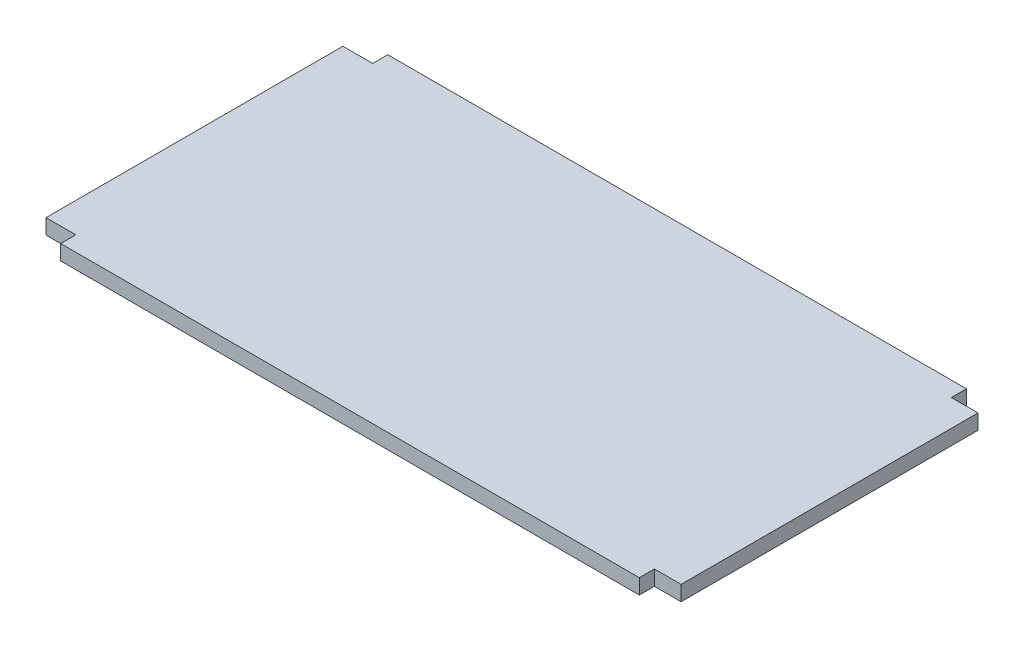
ISO-10303-21;
HEADER;
FILE_DESCRIPTION(('STEP AP214'),'2;1');
FILE_NAME('part.step','',(''),(''),'','','');
FILE_SCHEMA(('AUTOMOTIVE_DESIGN { 1 0 10303 214 1 1 1 1 }'));
ENDSEC;
DATA;
#1=APPLICATION_CONTEXT('core data for automotive mechanical design processes');
#2=APPLICATION_PROTOCOL_DEFINITION('international standard','automotive_design',2000,#1);
#3=PRODUCT_CONTEXT('',#1,'mechanical');
#4=PRODUCT('Part','Part','',(#3));
#5=PRODUCT_RELATED_PRODUCT_CATEGORY('part','',(#4));
#6=PRODUCT_DEFINITION_FORMATION('','',#4);
#7=PRODUCT_DEFINITION_CONTEXT('part definition',#1,'design');
#8=PRODUCT_DEFINITION('design','',#6,#7);
#9=PRODUCT_DEFINITION_SHAPE('','',#8);
#10=(LENGTH_UNIT() NAMED_UNIT(*) SI_UNIT(.MILLI.,.METRE.));
#11=(NAMED_UNIT(*) PLANE_ANGLE_UNIT() SI_UNIT($,.RADIAN.));
#12=(NAMED_UNIT(*) SI_UNIT($,.STERADIAN.) SOLID_ANGLE_UNIT());
#13=UNCERTAINTY_MEASURE_WITH_UNIT(LENGTH_MEASURE(1.E-05),#10,'distance_accuracy_value','');
#14=(GEOMETRIC_REPRESENTATION_CONTEXT(3) GLOBAL_UNCERTAINTY_ASSIGNED_CONTEXT((#13)) GLOBAL_UNIT_ASSIGNED_CONTEXT((#10,
#11,#12)) REPRESENTATION_CONTEXT('',''));
#15=CARTESIAN_POINT('',(0.,0.,0.));
#16=DIRECTION('',(0.,0.,1.));
#17=DIRECTION('',(1.,0.,0.));
#18=AXIS2_PLACEMENT_3D('',#15,#16,#17);
#19=CARTESIAN_POINT('',(57.5,-3.,29.5));
#20=DIRECTION('',(1.,0.,0.));
#21=DIRECTION('',(0.,0.,-1.));
#22=AXIS2_PLACEMENT_3D('',#19,#20,#21);
#23=PLANE('',#22);
#24=DIRECTION('',(0.,0.,-1.));
#25=VECTOR('',#24,1.);
#26=CARTESIAN_POINT('',(57.5,0.,29.5));
#27=LINE('',#26,#25);
#28=CARTESIAN_POINT('',(57.5,0.,32.5));
#29=VERTEX_POINT('',#28);
#30=CARTESIAN_POINT('',(57.5,0.,29.5));
#31=VERTEX_POINT('',#30);
#32=EDGE_CURVE('E154',#29,#31,#27,.T.);
#33=ORIENTED_EDGE('',*,*,#32,.F.);
#34=DIRECTION('',(0.,1.,0.));
#35=VECTOR('',#34,1.);
#36=CARTESIAN_POINT('',(57.5,-3.,32.5));
#37=LINE('',#36,#35);
#38=CARTESIAN_POINT('',(57.5,-3.,32.5));
#39=VERTEX_POINT('',#38);
#40=EDGE_CURVE('E11',#39,#29,#37,.T.);
#41=ORIENTED_EDGE('',*,*,#40,.F.);
#42=DIRECTION('',(0.,0.,-1.));
#43=VECTOR('',#42,1.);
#44=CARTESIAN_POINT('',(57.5,-3.,29.5));
#45=LINE('',#44,#43);
#46=CARTESIAN_POINT('',(57.5,-3.,29.5));
#47=VERTEX_POINT('',#46);
#48=EDGE_CURVE('E186',#39,#47,#45,.T.);
#49=ORIENTED_EDGE('',*,*,#48,.T.);
#50=DIRECTION('',(0.,1.,0.));
#51=VECTOR('',#50,1.);
#52=CARTESIAN_POINT('',(57.5,-3.,29.5));
#53=LINE('',#52,#51);
#54=EDGE_CURVE('E36',#47,#31,#53,.T.);
#55=ORIENTED_EDGE('',*,*,#54,.T.);
#56=EDGE_LOOP('',(#33,#41,#49,#55));
#57=FACE_BOUND('',#56,.T.);
#58=ADVANCED_FACE('F33',(#57),#23,.T.);
#59=CARTESIAN_POINT('',(-57.5,-3.,32.5));
#60=DIRECTION('',(0.,0.,1.));
#61=DIRECTION('',(1.,0.,0.));
#62=AXIS2_PLACEMENT_3D('',#59,#60,#61);
#63=PLANE('',#62);
#64=DIRECTION('',(1.,0.,0.));
#65=VECTOR('',#64,1.);
#66=CARTESIAN_POINT('',(-57.5,0.,32.5));
#67=LINE('',#66,#65);
#68=CARTESIAN_POINT('',(-57.5,0.,32.5));
#69=VERTEX_POINT('',#68);
#70=EDGE_CURVE('E184',#69,#29,#67,.T.);
#71=ORIENTED_EDGE('',*,*,#70,.F.);
#72=DIRECTION('',(0.,1.,0.));
#73=VECTOR('',#72,1.);
#74=CARTESIAN_POINT('',(-57.5,-3.,32.5));
#75=LINE('',#74,#73);
#76=CARTESIAN_POINT('',(-57.5,-3.,32.5));
#77=VERTEX_POINT('',#76);
#78=EDGE_CURVE('E42',#77,#69,#75,.T.);
#79=ORIENTED_EDGE('',*,*,#78,.F.);
#80=DIRECTION('',(1.,0.,0.));
#81=VECTOR('',#80,1.);
#82=CARTESIAN_POINT('',(-57.5,-3.,32.5));
#83=LINE('',#82,#81);
#84=EDGE_CURVE('E144',#77,#39,#83,.T.);
#85=ORIENTED_EDGE('',*,*,#84,.T.);
#86=ORIENTED_EDGE('',*,*,#40,.T.);
#87=EDGE_LOOP('',(#71,#79,#85,#86));
#88=FACE_BOUND('',#87,.T.);
#89=ADVANCED_FACE('F206',(#88),#63,.T.);
#90=CARTESIAN_POINT('',(-57.5,-3.,29.5));
#91=DIRECTION('',(-1.,0.,0.));
#92=DIRECTION('',(0.,0.,1.));
#93=AXIS2_PLACEMENT_3D('',#90,#91,#92);
#94=PLANE('',#93);
#95=DIRECTION('',(0.,0.,1.));
#96=VECTOR('',#95,1.);
#97=CARTESIAN_POINT('',(-57.5,0.,29.5));
#98=LINE('',#97,#96);
#99=CARTESIAN_POINT('',(-57.5,0.,29.5));
#100=VERTEX_POINT('',#99);
#101=EDGE_CURVE('E131',#100,#69,#98,.T.);
#102=ORIENTED_EDGE('',*,*,#101,.F.);
#103=DIRECTION('',(0.,1.,0.));
#104=VECTOR('',#103,1.);
#105=CARTESIAN_POINT('',(-57.5,-3.,29.5));
#106=LINE('',#105,#104);
#107=CARTESIAN_POINT('',(-57.5,-3.,29.5));
#108=VERTEX_POINT('',#107);
#109=EDGE_CURVE('E126',#108,#100,#106,.T.);
#110=ORIENTED_EDGE('',*,*,#109,.F.);
#111=DIRECTION('',(0.,0.,1.));
#112=VECTOR('',#111,1.);
#113=CARTESIAN_POINT('',(-57.5,-3.,29.5));
#114=LINE('',#113,#112);
#115=EDGE_CURVE('E129',#108,#77,#114,.T.);
#116=ORIENTED_EDGE('',*,*,#115,.T.);
#117=ORIENTED_EDGE('',*,*,#78,.T.);
#118=EDGE_LOOP('',(#102,#110,#116,#117));
#119=FACE_BOUND('',#118,.T.);
#120=ADVANCED_FACE('F128',(#119),#94,.T.);
#121=CARTESIAN_POINT('',(-63.418,-3.,29.5));
#122=DIRECTION('',(0.,0.,1.));
#123=DIRECTION('',(1.,0.,0.));
#124=AXIS2_PLACEMENT_3D('',#121,#122,#123);
#125=PLANE('',#124);
#126=DIRECTION('',(1.,0.,0.));
#127=VECTOR('',#126,1.);
#128=CARTESIAN_POINT('',(-63.418,0.,29.5));
#129=LINE('',#128,#127);
#130=CARTESIAN_POINT('',(-63.418,0.,29.5));
#131=VERTEX_POINT('',#130);
#132=EDGE_CURVE('E181',#131,#100,#129,.T.);
#133=ORIENTED_EDGE('',*,*,#132,.F.);
#134=DIRECTION('',(0.,1.,0.));
#135=VECTOR('',#134,1.);
#136=CARTESIAN_POINT('',(-63.418,-3.,29.5));
#137=LINE('',#136,#135);
#138=CARTESIAN_POINT('',(-63.418,-3.,29.5));
#139=VERTEX_POINT('',#138);
#140=EDGE_CURVE('E136',#139,#131,#137,.T.);
#141=ORIENTED_EDGE('',*,*,#140,.F.);
#142=DIRECTION('',(1.,0.,0.));
#143=VECTOR('',#142,1.);
#144=CARTESIAN_POINT('',(-63.418,-3.,29.5));
#145=LINE('',#144,#143);
#146=EDGE_CURVE('E142',#139,#108,#145,.T.);
#147=ORIENTED_EDGE('',*,*,#146,.T.);
#148=ORIENTED_EDGE('',*,*,#109,.T.);
#149=EDGE_LOOP('',(#133,#141,#147,#148));
#150=FACE_BOUND('',#149,.T.);
#151=ADVANCED_FACE('F146',(#150),#125,.T.);
#152=CARTESIAN_POINT('',(-63.418,-3.,-29.5));
#153=DIRECTION('',(-1.,0.,0.));
#154=DIRECTION('',(0.,0.,1.));
#155=AXIS2_PLACEMENT_3D('',#152,#153,#154);
#156=PLANE('',#155);
#157=DIRECTION('',(0.,0.,1.));
#158=VECTOR('',#157,1.);
#159=CARTESIAN_POINT('',(-63.418,0.,-29.5));
#160=LINE('',#159,#158);
#161=CARTESIAN_POINT('',(-63.418,0.,-29.5));
#162=VERTEX_POINT('',#161);
#163=EDGE_CURVE('E178',#162,#131,#160,.T.);
#164=ORIENTED_EDGE('',*,*,#163,.F.);
#165=DIRECTION('',(0.,1.,0.));
#166=VECTOR('',#165,1.);
#167=CARTESIAN_POINT('',(-63.418,-3.,-29.5));
#168=LINE('',#167,#166);
#169=CARTESIAN_POINT('',(-63.418,-3.,-29.5));
#170=VERTEX_POINT('',#169);
#171=EDGE_CURVE('E190',#170,#162,#168,.T.);
#172=ORIENTED_EDGE('',*,*,#171,.F.);
#173=DIRECTION('',(0.,0.,1.));
#174=VECTOR('',#173,1.);
#175=CARTESIAN_POINT('',(-63.418,-3.,-29.5));
#176=LINE('',#175,#174);
#177=EDGE_CURVE('E147',#170,#139,#176,.T.);
#178=ORIENTED_EDGE('',*,*,#177,.T.);
#179=ORIENTED_EDGE('',*,*,#140,.T.);
#180=EDGE_LOOP('',(#164,#172,#178,#179));
#181=FACE_BOUND('',#180,.T.);
#182=ADVANCED_FACE('F219',(#181),#156,.T.);
#183=CARTESIAN_POINT('',(-57.5,-3.,-29.5));
#184=DIRECTION('',(0.,0.,-1.));
#185=DIRECTION('',(-1.,0.,0.));
#186=AXIS2_PLACEMENT_3D('',#183,#184,#185);
#187=PLANE('',#186);
#188=DIRECTION('',(-1.,0.,0.));
#189=VECTOR('',#188,1.);
#190=CARTESIAN_POINT('',(-57.5,0.,-29.5));
#191=LINE('',#190,#189);
#192=CARTESIAN_POINT('',(-57.5,0.,-29.5));
#193=VERTEX_POINT('',#192);
#194=EDGE_CURVE('E175',#193,#162,#191,.T.);
#195=ORIENTED_EDGE('',*,*,#194,.F.);
#196=DIRECTION('',(0.,1.,0.));
#197=VECTOR('',#196,1.);
#198=CARTESIAN_POINT('',(-57.5,-3.,-29.5));
#199=LINE('',#198,#197);
#200=CARTESIAN_POINT('',(-57.5,-3.,-29.5));
#201=VERTEX_POINT('',#200);
#202=EDGE_CURVE('E192',#201,#193,#199,.T.);
#203=ORIENTED_EDGE('',*,*,#202,.F.);
#204=DIRECTION('',(-1.,0.,0.));
#205=VECTOR('',#204,1.);
#206=CARTESIAN_POINT('',(-57.5,-3.,-29.5));
#207=LINE('',#206,#205);
#208=EDGE_CURVE('E149',#201,#170,#207,.T.);
#209=ORIENTED_EDGE('',*,*,#208,.T.);
#210=ORIENTED_EDGE('',*,*,#171,.T.);
#211=EDGE_LOOP('',(#195,#203,#209,#210));
#212=FACE_BOUND('',#211,.T.);
#213=ADVANCED_FACE('F222',(#212),#187,.T.);
#214=CARTESIAN_POINT('',(-57.5,-3.,-32.5));
#215=DIRECTION('',(-1.,0.,0.));
#216=DIRECTION('',(0.,0.,1.));
#217=AXIS2_PLACEMENT_3D('',#214,#215,#216);
#218=PLANE('',#217);
#219=DIRECTION('',(0.,0.,1.));
#220=VECTOR('',#219,1.);
#221=CARTESIAN_POINT('',(-57.5,0.,-32.5));
#222=LINE('',#221,#220);
#223=CARTESIAN_POINT('',(-57.5,0.,-32.5));
#224=VERTEX_POINT('',#223);
#225=EDGE_CURVE('E172',#224,#193,#222,.T.);
#226=ORIENTED_EDGE('',*,*,#225,.F.);
#227=DIRECTION('',(0.,1.,0.));
#228=VECTOR('',#227,1.);
#229=CARTESIAN_POINT('',(-57.5,-3.,-32.5));
#230=LINE('',#229,#228);
#231=CARTESIAN_POINT('',(-57.5,-3.,-32.5));
#232=VERTEX_POINT('',#231);
#233=EDGE_CURVE('E194',#232,#224,#230,.T.);
#234=ORIENTED_EDGE('',*,*,#233,.F.);
#235=DIRECTION('',(0.,0.,1.));
#236=VECTOR('',#235,1.);
#237=CARTESIAN_POINT('',(-57.5,-3.,-32.5));
#238=LINE('',#237,#236);
#239=EDGE_CURVE('E348',#232,#201,#238,.T.);
#240=ORIENTED_EDGE('',*,*,#239,.T.);
#241=ORIENTED_EDGE('',*,*,#202,.T.);
#242=EDGE_LOOP('',(#226,#234,#240,#241));
#243=FACE_BOUND('',#242,.T.);
#244=ADVANCED_FACE('F226',(#243),#218,.T.);
#245=CARTESIAN_POINT('',(-57.5,-3.,-32.5));
#246=DIRECTION('',(0.,0.,-1.));
#247=DIRECTION('',(-1.,0.,0.));
#248=AXIS2_PLACEMENT_3D('',#245,#246,#247);
#249=PLANE('',#248);
#250=DIRECTION('',(-1.,0.,0.));
#251=VECTOR('',#250,1.);
#252=CARTESIAN_POINT('',(-57.5,0.,-32.5));
#253=LINE('',#252,#251);
#254=CARTESIAN_POINT('',(57.5,0.,-32.5));
#255=VERTEX_POINT('',#254);
#256=EDGE_CURVE('E169',#255,#224,#253,.T.);
#257=ORIENTED_EDGE('',*,*,#256,.F.);
#258=DIRECTION('',(0.,1.,0.));
#259=VECTOR('',#258,1.);
#260=CARTESIAN_POINT('',(57.5,-3.,-32.5));
#261=LINE('',#260,#259);
#262=CARTESIAN_POINT('',(57.5,-3.,-32.5));
#263=VERTEX_POINT('',#262);
#264=EDGE_CURVE('E196',#263,#255,#261,.T.);
#265=ORIENTED_EDGE('',*,*,#264,.F.);
#266=DIRECTION('',(-1.,0.,0.));
#267=VECTOR('',#266,1.);
#268=CARTESIAN_POINT('',(-57.5,-3.,-32.5));
#269=LINE('',#268,#267);
#270=EDGE_CURVE('E352',#263,#232,#269,.T.);
#271=ORIENTED_EDGE('',*,*,#270,.T.);
#272=ORIENTED_EDGE('',*,*,#233,.T.);
#273=EDGE_LOOP('',(#257,#265,#271,#272));
#274=FACE_BOUND('',#273,.T.);
#275=ADVANCED_FACE('F230',(#274),#249,.T.);
#276=CARTESIAN_POINT('',(57.5,-3.,-32.5));
#277=DIRECTION('',(1.,0.,0.));
#278=DIRECTION('',(0.,0.,-1.));
#279=AXIS2_PLACEMENT_3D('',#276,#277,#278);
#280=PLANE('',#279);
#281=DIRECTION('',(0.,0.,-1.));
#282=VECTOR('',#281,1.);
#283=CARTESIAN_POINT('',(57.5,0.,-32.5));
#284=LINE('',#283,#282);
#285=CARTESIAN_POINT('',(57.5,0.,-29.5));
#286=VERTEX_POINT('',#285);
#287=EDGE_CURVE('E166',#286,#255,#284,.T.);
#288=ORIENTED_EDGE('',*,*,#287,.F.);
#289=DIRECTION('',(0.,1.,0.));
#290=VECTOR('',#289,1.);
#291=CARTESIAN_POINT('',(57.5,-3.,-29.5));
#292=LINE('',#291,#290);
#293=CARTESIAN_POINT('',(57.5,-3.,-29.5));
#294=VERTEX_POINT('',#293);
#295=EDGE_CURVE('E198',#294,#286,#292,.T.);
#296=ORIENTED_EDGE('',*,*,#295,.F.);
#297=DIRECTION('',(0.,0.,-1.));
#298=VECTOR('',#297,1.);
#299=CARTESIAN_POINT('',(57.5,-3.,-32.5));
#300=LINE('',#299,#298);
#301=EDGE_CURVE('E341',#294,#263,#300,.T.);
#302=ORIENTED_EDGE('',*,*,#301,.T.);
#303=ORIENTED_EDGE('',*,*,#264,.T.);
#304=EDGE_LOOP('',(#288,#296,#302,#303));
#305=FACE_BOUND('',#304,.T.);
#306=ADVANCED_FACE('F234',(#305),#280,.T.);
#307=CARTESIAN_POINT('',(57.5,-3.,-29.5));
#308=DIRECTION('',(0.,0.,-1.));
#309=DIRECTION('',(-1.,0.,0.));
#310=AXIS2_PLACEMENT_3D('',#307,#308,#309);
#311=PLANE('',#310);
#312=DIRECTION('',(-1.,0.,0.));
#313=VECTOR('',#312,1.);
#314=CARTESIAN_POINT('',(57.5,0.,-29.5));
#315=LINE('',#314,#313);
#316=CARTESIAN_POINT('',(62.806,0.,-29.5));
#317=VERTEX_POINT('',#316);
#318=EDGE_CURVE('E163',#317,#286,#315,.T.);
#319=ORIENTED_EDGE('',*,*,#318,.F.);
#320=DIRECTION('',(0.,1.,0.));
#321=VECTOR('',#320,1.);
#322=CARTESIAN_POINT('',(62.806,-3.,-29.5));
#323=LINE('',#322,#321);
#324=CARTESIAN_POINT('',(62.806,-3.,-29.5));
#325=VERTEX_POINT('',#324);
#326=EDGE_CURVE('E200',#325,#317,#323,.T.);
#327=ORIENTED_EDGE('',*,*,#326,.F.);
#328=DIRECTION('',(-1.,0.,0.));
#329=VECTOR('',#328,1.);
#330=CARTESIAN_POINT('',(57.5,-3.,-29.5));
#331=LINE('',#330,#329);
#332=EDGE_CURVE('E337',#325,#294,#331,.T.);
#333=ORIENTED_EDGE('',*,*,#332,.T.);
#334=ORIENTED_EDGE('',*,*,#295,.T.);
#335=EDGE_LOOP('',(#319,#327,#333,#334));
#336=FACE_BOUND('',#335,.T.);
#337=ADVANCED_FACE('F238',(#336),#311,.T.);
#338=CARTESIAN_POINT('',(62.806,-3.,-29.5));
#339=DIRECTION('',(1.,0.,0.));
#340=DIRECTION('',(0.,0.,-1.));
#341=AXIS2_PLACEMENT_3D('',#338,#339,#340);
#342=PLANE('',#341);
#343=DIRECTION('',(0.,0.,-1.));
#344=VECTOR('',#343,1.);
#345=CARTESIAN_POINT('',(62.806,0.,-29.5));
#346=LINE('',#345,#344);
#347=CARTESIAN_POINT('',(62.806,0.,29.5));
#348=VERTEX_POINT('',#347);
#349=EDGE_CURVE('E160',#348,#317,#346,.T.);
#350=ORIENTED_EDGE('',*,*,#349,.F.);
#351=DIRECTION('',(0.,1.,0.));
#352=VECTOR('',#351,1.);
#353=CARTESIAN_POINT('',(62.806,-3.,29.5));
#354=LINE('',#353,#352);
#355=CARTESIAN_POINT('',(62.806,-3.,29.5));
#356=VERTEX_POINT('',#355);
#357=EDGE_CURVE('E201',#356,#348,#354,.T.);
#358=ORIENTED_EDGE('',*,*,#357,.F.);
#359=DIRECTION('',(0.,0.,-1.));
#360=VECTOR('',#359,1.);
#361=CARTESIAN_POINT('',(62.806,-3.,-29.5));
#362=LINE('',#361,#360);
#363=EDGE_CURVE('E358',#356,#325,#362,.T.);
#364=ORIENTED_EDGE('',*,*,#363,.T.);
#365=ORIENTED_EDGE('',*,*,#326,.T.);
#366=EDGE_LOOP('',(#350,#358,#364,#365));
#367=FACE_BOUND('',#366,.T.);
#368=ADVANCED_FACE('F242',(#367),#342,.T.);
#369=CARTESIAN_POINT('',(62.806,-3.,29.5));
#370=DIRECTION('',(0.,0.,1.));
#371=DIRECTION('',(1.,0.,0.));
#372=AXIS2_PLACEMENT_3D('',#369,#370,#371);
#373=PLANE('',#372);
#374=DIRECTION('',(1.,0.,0.));
#375=VECTOR('',#374,1.);
#376=CARTESIAN_POINT('',(62.806,0.,29.5));
#377=LINE('',#376,#375);
#378=EDGE_CURVE('E157',#31,#348,#377,.T.);
#379=ORIENTED_EDGE('',*,*,#378,.F.);
#380=ORIENTED_EDGE('',*,*,#54,.F.);
#381=DIRECTION('',(1.,0.,0.));
#382=VECTOR('',#381,1.);
#383=CARTESIAN_POINT('',(62.806,-3.,29.5));
#384=LINE('',#383,#382);
#385=EDGE_CURVE('E360',#47,#356,#384,.T.);
#386=ORIENTED_EDGE('',*,*,#385,.T.);
#387=ORIENTED_EDGE('',*,*,#357,.T.);
#388=EDGE_LOOP('',(#379,#380,#386,#387));
#389=FACE_BOUND('',#388,.T.);
#390=ADVANCED_FACE('F203',(#389),#373,.T.);
#391=CARTESIAN_POINT('',(0.,-3.,0.));
#392=DIRECTION('',(0.,1.,0.));
#393=DIRECTION('',(0.,0.,1.));
#394=AXIS2_PLACEMENT_3D('',#391,#392,#393);
#395=PLANE('',#394);
#396=ORIENTED_EDGE('',*,*,#48,.F.);
#397=ORIENTED_EDGE('',*,*,#84,.F.);
#398=ORIENTED_EDGE('',*,*,#115,.F.);
#399=ORIENTED_EDGE('',*,*,#146,.F.);
#400=ORIENTED_EDGE('',*,*,#177,.F.);
#401=ORIENTED_EDGE('',*,*,#208,.F.);
#402=ORIENTED_EDGE('',*,*,#239,.F.);
#403=ORIENTED_EDGE('',*,*,#270,.F.);
#404=ORIENTED_EDGE('',*,*,#301,.F.);
#405=ORIENTED_EDGE('',*,*,#332,.F.);
#406=ORIENTED_EDGE('',*,*,#363,.F.);
#407=ORIENTED_EDGE('',*,*,#385,.F.);
#408=EDGE_LOOP('',(#396,#397,#398,#399,#400,#401,#402,#403,#404,#405,#406,#407));
#409=FACE_BOUND('',#408,.T.);
#410=ADVANCED_FACE('F140',(#409),#395,.F.);
#411=CARTESIAN_POINT('',(0.,0.,0.));
#412=DIRECTION('',(0.,1.,0.));
#413=DIRECTION('',(0.,0.,1.));
#414=AXIS2_PLACEMENT_3D('',#411,#412,#413);
#415=PLANE('',#414);
#416=ORIENTED_EDGE('',*,*,#32,.T.);
#417=ORIENTED_EDGE('',*,*,#378,.T.);
#418=ORIENTED_EDGE('',*,*,#349,.T.);
#419=ORIENTED_EDGE('',*,*,#318,.T.);
#420=ORIENTED_EDGE('',*,*,#287,.T.);
#421=ORIENTED_EDGE('',*,*,#256,.T.);
#422=ORIENTED_EDGE('',*,*,#225,.T.);
#423=ORIENTED_EDGE('',*,*,#194,.T.);
#424=ORIENTED_EDGE('',*,*,#163,.T.);
#425=ORIENTED_EDGE('',*,*,#132,.T.);
#426=ORIENTED_EDGE('',*,*,#101,.T.);
#427=ORIENTED_EDGE('',*,*,#70,.T.);
#428=EDGE_LOOP('',(#416,#417,#418,#419,#420,#421,#422,#423,#424,#425,#426,#427));
#429=FACE_BOUND('',#428,.T.);
#430=ADVANCED_FACE('F205',(#429),#415,.T.);
#431=CLOSED_SHELL('',(#58,#89,#120,#151,#182,#213,#244,#275,#306,#337,#368,#390,#410,#430));
#432=MANIFOLD_SOLID_BREP('B2',#431);
#433=ADVANCED_BREP_SHAPE_REPRESENTATION('',(#18,#432),#14);
#434=SHAPE_DEFINITION_REPRESENTATION(#9,#433);
ENDSEC;
END-ISO-10303-21;
